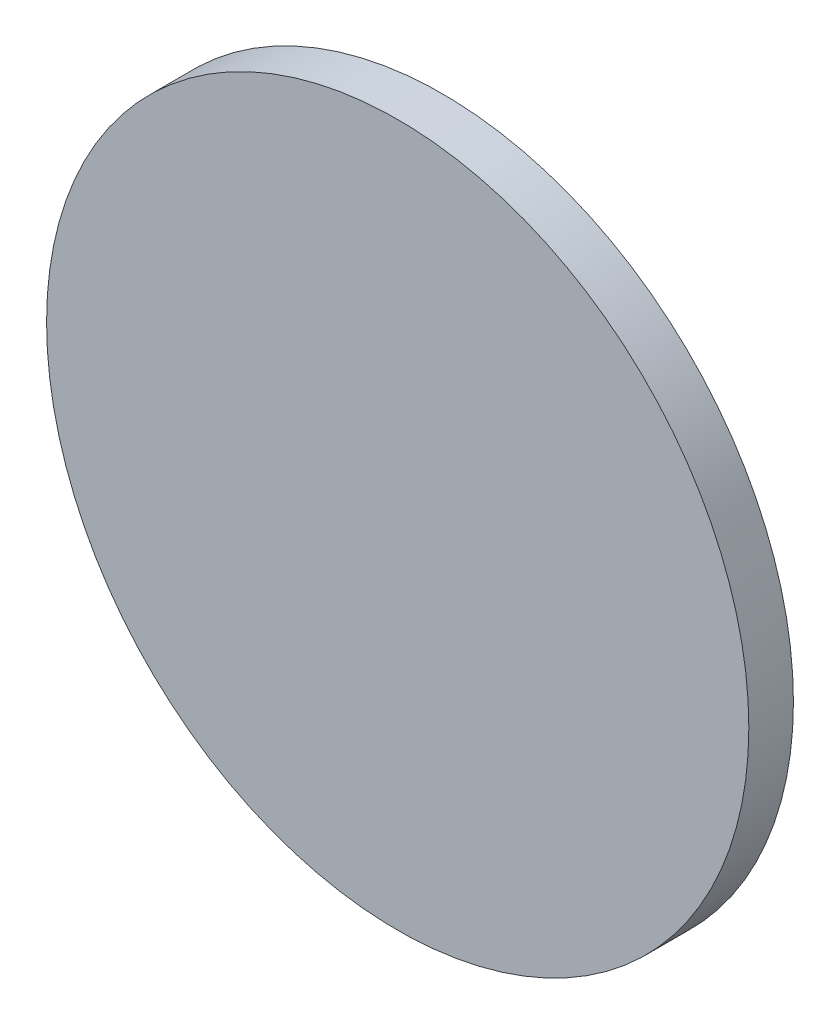
ISO-10303-21;
HEADER;
FILE_DESCRIPTION(('STEP AP214'),'2;1');
FILE_NAME('part.step','',(''),(''),'','','');
FILE_SCHEMA(('AUTOMOTIVE_DESIGN { 1 0 10303 214 1 1 1 1 }'));
ENDSEC;
DATA;
#1=APPLICATION_CONTEXT('core data for automotive mechanical design processes');
#2=APPLICATION_PROTOCOL_DEFINITION('international standard','automotive_design',2000,#1);
#3=PRODUCT_CONTEXT('',#1,'mechanical');
#4=PRODUCT('Part','Part','',(#3));
#5=PRODUCT_RELATED_PRODUCT_CATEGORY('part','',(#4));
#6=PRODUCT_DEFINITION_FORMATION('','',#4);
#7=PRODUCT_DEFINITION_CONTEXT('part definition',#1,'design');
#8=PRODUCT_DEFINITION('design','',#6,#7);
#9=PRODUCT_DEFINITION_SHAPE('','',#8);
#10=(LENGTH_UNIT() NAMED_UNIT(*) SI_UNIT(.MILLI.,.METRE.));
#11=(NAMED_UNIT(*) PLANE_ANGLE_UNIT() SI_UNIT($,.RADIAN.));
#12=(NAMED_UNIT(*) SI_UNIT($,.STERADIAN.) SOLID_ANGLE_UNIT());
#13=UNCERTAINTY_MEASURE_WITH_UNIT(LENGTH_MEASURE(1.E-05),#10,'distance_accuracy_value','');
#14=(GEOMETRIC_REPRESENTATION_CONTEXT(3) GLOBAL_UNCERTAINTY_ASSIGNED_CONTEXT((#13)) GLOBAL_UNIT_ASSIGNED_CONTEXT((#10,
#11,#12)) REPRESENTATION_CONTEXT('',''));
#15=CARTESIAN_POINT('',(0.,0.,0.));
#16=DIRECTION('',(0.,0.,1.));
#17=DIRECTION('',(1.,0.,0.));
#18=AXIS2_PLACEMENT_3D('',#15,#16,#17);
#19=CARTESIAN_POINT('',(0.,0.,3.175));
#20=DIRECTION('',(0.,0.,-1.));
#21=DIRECTION('',(-1.,0.,0.));
#22=AXIS2_PLACEMENT_3D('',#19,#20,#21);
#23=CYLINDRICAL_SURFACE('',#22,25.);
#24=CARTESIAN_POINT('',(0.,0.,3.175));
#25=DIRECTION('',(0.,0.,1.));
#26=DIRECTION('',(1.,0.,0.));
#27=AXIS2_PLACEMENT_3D('',#24,#25,#26);
#28=CIRCLE('',#27,25.);
#29=CARTESIAN_POINT('',(25.,0.,3.175));
#30=VERTEX_POINT('',#29);
#31=EDGE_CURVE('E10',#30,#30,#28,.T.);
#32=ORIENTED_EDGE('',*,*,#31,.F.);
#33=EDGE_LOOP('',(#32));
#34=FACE_BOUND('',#33,.T.);
#35=CARTESIAN_POINT('',(0.,0.,0.));
#36=DIRECTION('',(0.,0.,1.));
#37=DIRECTION('',(1.,0.,0.));
#38=AXIS2_PLACEMENT_3D('',#35,#36,#37);
#39=CIRCLE('',#38,25.);
#40=CARTESIAN_POINT('',(25.,0.,0.));
#41=VERTEX_POINT('',#40);
#42=EDGE_CURVE('E40',#41,#41,#39,.T.);
#43=ORIENTED_EDGE('',*,*,#42,.T.);
#44=EDGE_LOOP('',(#43));
#45=FACE_BOUND('',#44,.T.);
#46=ADVANCED_FACE('F37',(#34,#45),#23,.T.);
#47=CARTESIAN_POINT('',(0.,0.,3.175));
#48=DIRECTION('',(0.,0.,1.));
#49=DIRECTION('',(1.,0.,0.));
#50=AXIS2_PLACEMENT_3D('',#47,#48,#49);
#51=PLANE('',#50);
#52=ORIENTED_EDGE('',*,*,#31,.T.);
#53=EDGE_LOOP('',(#52));
#54=FACE_BOUND('',#53,.T.);
#55=ADVANCED_FACE('F52',(#54),#51,.T.);
#56=CARTESIAN_POINT('',(0.,0.,0.));
#57=DIRECTION('',(0.,0.,1.));
#58=DIRECTION('',(1.,0.,0.));
#59=AXIS2_PLACEMENT_3D('',#56,#57,#58);
#60=PLANE('',#59);
#61=ORIENTED_EDGE('',*,*,#42,.F.);
#62=EDGE_LOOP('',(#61));
#63=FACE_BOUND('',#62,.T.);
#64=ADVANCED_FACE('F50',(#63),#60,.F.);
#65=CLOSED_SHELL('',(#46,#55,#64));
#66=MANIFOLD_SOLID_BREP('B2',#65);
#67=ADVANCED_BREP_SHAPE_REPRESENTATION('',(#18,#66),#14);
#68=SHAPE_DEFINITION_REPRESENTATION(#9,#67);
ENDSEC;
END-ISO-10303-21;
